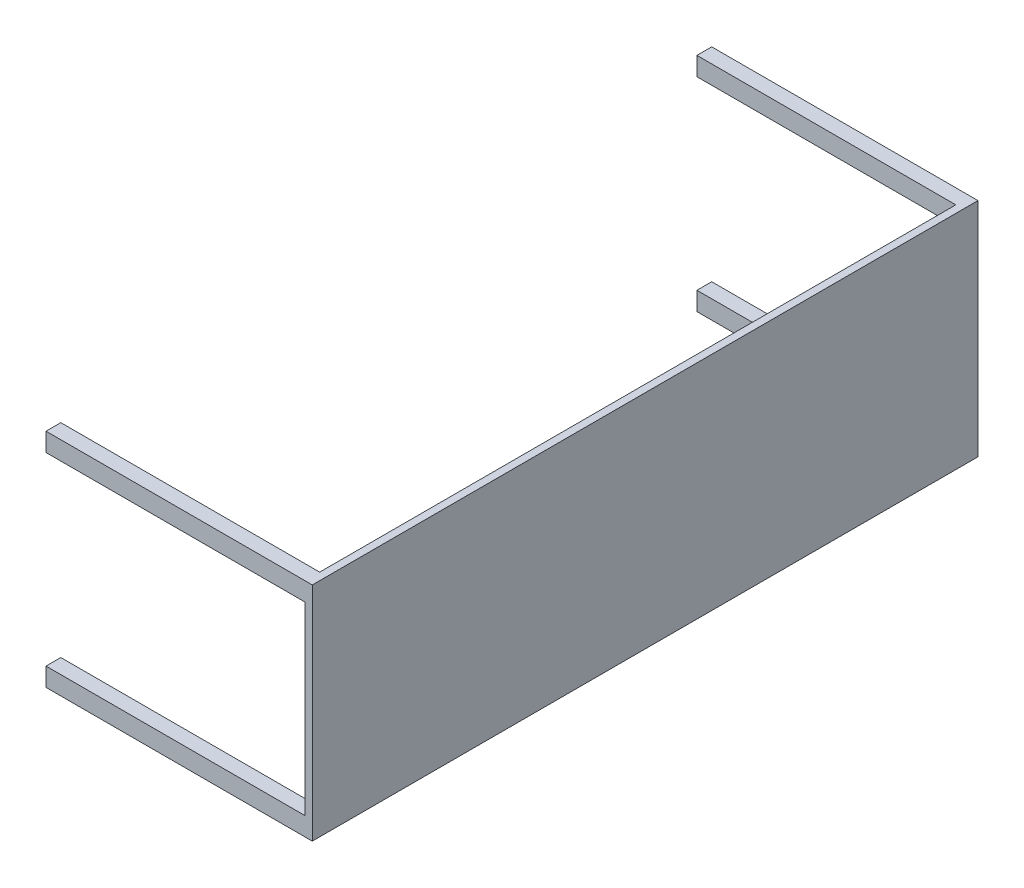
ISO-10303-21;
HEADER;
FILE_DESCRIPTION(('STEP AP214'),'2;1');
FILE_NAME('part.step','',(''),(''),'','','');
FILE_SCHEMA(('AUTOMOTIVE_DESIGN { 1 0 10303 214 1 1 1 1 }'));
ENDSEC;
DATA;
#1=APPLICATION_CONTEXT('core data for automotive mechanical design processes');
#2=APPLICATION_PROTOCOL_DEFINITION('international standard','automotive_design',2000,#1);
#3=PRODUCT_CONTEXT('',#1,'mechanical');
#4=PRODUCT('Part','Part','',(#3));
#5=PRODUCT_RELATED_PRODUCT_CATEGORY('part','',(#4));
#6=PRODUCT_DEFINITION_FORMATION('','',#4);
#7=PRODUCT_DEFINITION_CONTEXT('part definition',#1,'design');
#8=PRODUCT_DEFINITION('design','',#6,#7);
#9=PRODUCT_DEFINITION_SHAPE('','',#8);
#10=(LENGTH_UNIT() NAMED_UNIT(*) SI_UNIT(.MILLI.,.METRE.));
#11=(NAMED_UNIT(*) PLANE_ANGLE_UNIT() SI_UNIT($,.RADIAN.));
#12=(NAMED_UNIT(*) SI_UNIT($,.STERADIAN.) SOLID_ANGLE_UNIT());
#13=UNCERTAINTY_MEASURE_WITH_UNIT(LENGTH_MEASURE(1.E-05),#10,'distance_accuracy_value','');
#14=(GEOMETRIC_REPRESENTATION_CONTEXT(3) GLOBAL_UNCERTAINTY_ASSIGNED_CONTEXT((#13)) GLOBAL_UNIT_ASSIGNED_CONTEXT((#10,
#11,#12)) REPRESENTATION_CONTEXT('',''));
#15=CARTESIAN_POINT('',(0.,0.,0.));
#16=DIRECTION('',(0.,0.,1.));
#17=DIRECTION('',(1.,0.,0.));
#18=AXIS2_PLACEMENT_3D('',#15,#16,#17);
#19=CARTESIAN_POINT('',(0.,0.,0.));
#20=DIRECTION('',(1.,0.,0.));
#21=DIRECTION('',(0.,0.,-1.));
#22=AXIS2_PLACEMENT_3D('',#19,#20,#21);
#23=PLANE('',#22);
#24=DIRECTION('',(0.,1.,0.));
#25=VECTOR('',#24,1.);
#26=CARTESIAN_POINT('',(0.,410.745233968804,-1676.29116117851));
#27=LINE('',#26,#25);
#28=CARTESIAN_POINT('',(0.,360.745233968804,-1676.29116117851));
#29=VERTEX_POINT('',#28);
#30=CARTESIAN_POINT('',(0.,410.745233968804,-1676.29116117851));
#31=VERTEX_POINT('',#30);
#32=EDGE_CURVE('E214',#29,#31,#27,.T.);
#33=ORIENTED_EDGE('',*,*,#32,.F.);
#34=DIRECTION('',(0.,0.,1.));
#35=VECTOR('',#34,1.);
#36=CARTESIAN_POINT('',(0.,360.745233968804,-1676.29116117851));
#37=LINE('',#36,#35);
#38=CARTESIAN_POINT('',(0.,360.745233968804,-1716.29116117851));
#39=VERTEX_POINT('',#38);
#40=EDGE_CURVE('E68',#39,#29,#37,.T.);
#41=ORIENTED_EDGE('',*,*,#40,.F.);
#42=DIRECTION('',(0.,1.,0.));
#43=VECTOR('',#42,1.);
#44=CARTESIAN_POINT('',(0.,-189.254766031196,-1716.29116117851));
#45=LINE('',#44,#43);
#46=CARTESIAN_POINT('',(0.,-139.254766031196,-1716.29116117851));
#47=VERTEX_POINT('',#46);
#48=EDGE_CURVE('E159',#47,#39,#45,.T.);
#49=ORIENTED_EDGE('',*,*,#48,.F.);
#50=DIRECTION('',(0.,0.,-1.));
#51=VECTOR('',#50,1.);
#52=CARTESIAN_POINT('',(0.,-139.254766031196,-1676.29116117851));
#53=LINE('',#52,#51);
#54=CARTESIAN_POINT('',(0.,-139.254766031196,-1676.29116117851));
#55=VERTEX_POINT('',#54);
#56=EDGE_CURVE('E155',#55,#47,#53,.T.);
#57=ORIENTED_EDGE('',*,*,#56,.F.);
#58=DIRECTION('',(0.,1.,0.));
#59=VECTOR('',#58,1.);
#60=CARTESIAN_POINT('',(0.,-139.254766031196,-1676.29116117851));
#61=LINE('',#60,#59);
#62=CARTESIAN_POINT('',(0.,-189.254766031196,-1676.29116117851));
#63=VERTEX_POINT('',#62);
#64=EDGE_CURVE('E157',#63,#55,#61,.T.);
#65=ORIENTED_EDGE('',*,*,#64,.F.);
#66=DIRECTION('',(0.,0.,-1.));
#67=VECTOR('',#66,1.);
#68=CARTESIAN_POINT('',(0.,-189.254766031196,83.7088388214905));
#69=LINE('',#68,#67);
#70=CARTESIAN_POINT('',(0.,-189.254766031196,43.7088388214905));
#71=VERTEX_POINT('',#70);
#72=EDGE_CURVE('E295',#71,#63,#69,.T.);
#73=ORIENTED_EDGE('',*,*,#72,.F.);
#74=DIRECTION('',(0.,-1.,0.));
#75=VECTOR('',#74,1.);
#76=CARTESIAN_POINT('',(0.,-139.254766031196,43.7088388214905));
#77=LINE('',#76,#75);
#78=CARTESIAN_POINT('',(0.,-139.254766031196,43.7088388214905));
#79=VERTEX_POINT('',#78);
#80=EDGE_CURVE('E61',#79,#71,#77,.T.);
#81=ORIENTED_EDGE('',*,*,#80,.F.);
#82=DIRECTION('',(0.,0.,-1.));
#83=VECTOR('',#82,1.);
#84=CARTESIAN_POINT('',(0.,-139.254766031196,83.7088388214905));
#85=LINE('',#84,#83);
#86=CARTESIAN_POINT('',(0.,-139.254766031196,83.7088388214905));
#87=VERTEX_POINT('',#86);
#88=EDGE_CURVE('E205',#87,#79,#85,.T.);
#89=ORIENTED_EDGE('',*,*,#88,.F.);
#90=DIRECTION('',(0.,-1.,0.));
#91=VECTOR('',#90,1.);
#92=CARTESIAN_POINT('',(0.,-189.254766031196,83.7088388214905));
#93=LINE('',#92,#91);
#94=CARTESIAN_POINT('',(0.,360.745233968804,83.7088388214905));
#95=VERTEX_POINT('',#94);
#96=EDGE_CURVE('E301',#95,#87,#93,.T.);
#97=ORIENTED_EDGE('',*,*,#96,.F.);
#98=DIRECTION('',(0.,0.,1.));
#99=VECTOR('',#98,1.);
#100=CARTESIAN_POINT('',(0.,360.745233968804,83.7088388214905));
#101=LINE('',#100,#99);
#102=CARTESIAN_POINT('',(0.,360.745233968804,43.7088388214905));
#103=VERTEX_POINT('',#102);
#104=EDGE_CURVE('E267',#103,#95,#101,.T.);
#105=ORIENTED_EDGE('',*,*,#104,.F.);
#106=DIRECTION('',(0.,-1.,0.));
#107=VECTOR('',#106,1.);
#108=CARTESIAN_POINT('',(0.,410.745233968804,43.7088388214905));
#109=LINE('',#108,#107);
#110=CARTESIAN_POINT('',(0.,410.745233968804,43.7088388214905));
#111=VERTEX_POINT('',#110);
#112=EDGE_CURVE('E221',#111,#103,#109,.T.);
#113=ORIENTED_EDGE('',*,*,#112,.F.);
#114=DIRECTION('',(0.,0.,1.));
#115=VECTOR('',#114,1.);
#116=CARTESIAN_POINT('',(0.,410.745233968804,83.7088388214905));
#117=LINE('',#116,#115);
#118=EDGE_CURVE('E315',#31,#111,#117,.T.);
#119=ORIENTED_EDGE('',*,*,#118,.F.);
#120=EDGE_LOOP('',(#33,#41,#49,#57,#65,#73,#81,#89,#97,#105,#113,#119));
#121=FACE_BOUND('',#120,.T.);
#122=ADVANCED_FACE('F45',(#121),#23,.F.);
#123=CARTESIAN_POINT('',(20.,-189.254766031196,83.7088388214905));
#124=DIRECTION('',(0.,1.,0.));
#125=DIRECTION('',(0.,0.,1.));
#126=AXIS2_PLACEMENT_3D('',#123,#124,#125);
#127=PLANE('',#126);
#128=DIRECTION('',(-1.,0.,0.));
#129=VECTOR('',#128,1.);
#130=CARTESIAN_POINT('',(20.,-189.254766031196,83.7088388214905));
#131=LINE('',#130,#129);
#132=CARTESIAN_POINT('',(20.,-189.254766031196,83.7088388214905));
#133=VERTEX_POINT('',#132);
#134=CARTESIAN_POINT('',(-700.,-189.254766031196,83.7088388214905));
#135=VERTEX_POINT('',#134);
#136=EDGE_CURVE('E310',#133,#135,#131,.T.);
#137=ORIENTED_EDGE('',*,*,#136,.T.);
#138=DIRECTION('',(0.,0.,1.));
#139=VECTOR('',#138,1.);
#140=CARTESIAN_POINT('',(-700.,-189.254766031196,83.7088388214905));
#141=LINE('',#140,#139);
#142=CARTESIAN_POINT('',(-700.,-189.254766031196,43.7088388214905));
#143=VERTEX_POINT('',#142);
#144=EDGE_CURVE('E252',#143,#135,#141,.T.);
#145=ORIENTED_EDGE('',*,*,#144,.F.);
#146=DIRECTION('',(1.,0.,0.));
#147=VECTOR('',#146,1.);
#148=CARTESIAN_POINT('',(-700.,-189.254766031196,43.7088388214905));
#149=LINE('',#148,#147);
#150=EDGE_CURVE('E235',#143,#71,#149,.T.);
#151=ORIENTED_EDGE('',*,*,#150,.T.);
#152=ORIENTED_EDGE('',*,*,#72,.T.);
#153=DIRECTION('',(1.,0.,0.));
#154=VECTOR('',#153,1.);
#155=CARTESIAN_POINT('',(-700.,-189.254766031196,-1676.29116117851));
#156=LINE('',#155,#154);
#157=CARTESIAN_POINT('',(-700.,-189.254766031196,-1676.29116117851));
#158=VERTEX_POINT('',#157);
#159=EDGE_CURVE('E175',#158,#63,#156,.T.);
#160=ORIENTED_EDGE('',*,*,#159,.F.);
#161=DIRECTION('',(0.,0.,1.));
#162=VECTOR('',#161,1.);
#163=CARTESIAN_POINT('',(-700.,-189.254766031196,-1676.29116117851));
#164=LINE('',#163,#162);
#165=CARTESIAN_POINT('',(-700.,-189.254766031196,-1716.29116117851));
#166=VERTEX_POINT('',#165);
#167=EDGE_CURVE('E186',#166,#158,#164,.T.);
#168=ORIENTED_EDGE('',*,*,#167,.F.);
#169=DIRECTION('',(-1.,0.,0.));
#170=VECTOR('',#169,1.);
#171=CARTESIAN_POINT('',(20.,-189.254766031196,-1716.29116117851));
#172=LINE('',#171,#170);
#173=CARTESIAN_POINT('',(20.,-189.254766031196,-1716.29116117851));
#174=VERTEX_POINT('',#173);
#175=EDGE_CURVE('E11',#174,#166,#172,.T.);
#176=ORIENTED_EDGE('',*,*,#175,.F.);
#177=DIRECTION('',(0.,0.,-1.));
#178=VECTOR('',#177,1.);
#179=CARTESIAN_POINT('',(20.,-189.254766031196,83.7088388214905));
#180=LINE('',#179,#178);
#181=EDGE_CURVE('E296',#133,#174,#180,.T.);
#182=ORIENTED_EDGE('',*,*,#181,.F.);
#183=EDGE_LOOP('',(#137,#145,#151,#152,#160,#168,#176,#182));
#184=FACE_BOUND('',#183,.T.);
#185=ADVANCED_FACE('F47',(#184),#127,.F.);
#186=CARTESIAN_POINT('',(20.,-189.254766031196,-1716.29116117851));
#187=DIRECTION('',(0.,0.,1.));
#188=DIRECTION('',(1.,0.,0.));
#189=AXIS2_PLACEMENT_3D('',#186,#187,#188);
#190=PLANE('',#189);
#191=ORIENTED_EDGE('',*,*,#175,.T.);
#192=DIRECTION('',(0.,-1.,0.));
#193=VECTOR('',#192,1.);
#194=CARTESIAN_POINT('',(-700.,-139.254766031196,-1716.29116117851));
#195=LINE('',#194,#193);
#196=CARTESIAN_POINT('',(-700.,-139.254766031196,-1716.29116117851));
#197=VERTEX_POINT('',#196);
#198=EDGE_CURVE('E194',#197,#166,#195,.T.);
#199=ORIENTED_EDGE('',*,*,#198,.F.);
#200=DIRECTION('',(1.,0.,0.));
#201=VECTOR('',#200,1.);
#202=CARTESIAN_POINT('',(-700.,-139.254766031196,-1716.29116117851));
#203=LINE('',#202,#201);
#204=EDGE_CURVE('E188',#197,#47,#203,.T.);
#205=ORIENTED_EDGE('',*,*,#204,.T.);
#206=ORIENTED_EDGE('',*,*,#48,.T.);
#207=DIRECTION('',(1.,0.,0.));
#208=VECTOR('',#207,1.);
#209=CARTESIAN_POINT('',(-700.,360.745233968804,-1716.29116117851));
#210=LINE('',#209,#208);
#211=CARTESIAN_POINT('',(-700.,360.745233968804,-1716.29116117851));
#212=VERTEX_POINT('',#211);
#213=EDGE_CURVE('E200',#212,#39,#210,.T.);
#214=ORIENTED_EDGE('',*,*,#213,.F.);
#215=DIRECTION('',(0.,-1.,0.));
#216=VECTOR('',#215,1.);
#217=CARTESIAN_POINT('',(-700.,410.745233968804,-1716.29116117851));
#218=LINE('',#217,#216);
#219=CARTESIAN_POINT('',(-700.,410.745233968804,-1716.29116117851));
#220=VERTEX_POINT('',#219);
#221=EDGE_CURVE('E227',#220,#212,#218,.T.);
#222=ORIENTED_EDGE('',*,*,#221,.F.);
#223=DIRECTION('',(-1.,0.,0.));
#224=VECTOR('',#223,1.);
#225=CARTESIAN_POINT('',(20.,410.745233968804,-1716.29116117851));
#226=LINE('',#225,#224);
#227=CARTESIAN_POINT('',(20.,410.745233968804,-1716.29116117851));
#228=VERTEX_POINT('',#227);
#229=EDGE_CURVE('E54',#228,#220,#226,.T.);
#230=ORIENTED_EDGE('',*,*,#229,.F.);
#231=DIRECTION('',(0.,1.,0.));
#232=VECTOR('',#231,1.);
#233=CARTESIAN_POINT('',(20.,-189.254766031196,-1716.29116117851));
#234=LINE('',#233,#232);
#235=EDGE_CURVE('E300',#174,#228,#234,.T.);
#236=ORIENTED_EDGE('',*,*,#235,.F.);
#237=EDGE_LOOP('',(#191,#199,#205,#206,#214,#222,#230,#236));
#238=FACE_BOUND('',#237,.T.);
#239=ADVANCED_FACE('F336',(#238),#190,.F.);
#240=CARTESIAN_POINT('',(20.,410.745233968804,83.7088388214905));
#241=DIRECTION('',(0.,-1.,0.));
#242=DIRECTION('',(0.,0.,-1.));
#243=AXIS2_PLACEMENT_3D('',#240,#241,#242);
#244=PLANE('',#243);
#245=ORIENTED_EDGE('',*,*,#229,.T.);
#246=DIRECTION('',(0.,0.,-1.));
#247=VECTOR('',#246,1.);
#248=CARTESIAN_POINT('',(-700.,410.745233968804,-1676.29116117851));
#249=LINE('',#248,#247);
#250=CARTESIAN_POINT('',(-700.,410.745233968804,-1676.29116117851));
#251=VERTEX_POINT('',#250);
#252=EDGE_CURVE('E218',#251,#220,#249,.T.);
#253=ORIENTED_EDGE('',*,*,#252,.F.);
#254=DIRECTION('',(1.,0.,0.));
#255=VECTOR('',#254,1.);
#256=CARTESIAN_POINT('',(-700.,410.745233968804,-1676.29116117851));
#257=LINE('',#256,#255);
#258=EDGE_CURVE('E209',#251,#31,#257,.T.);
#259=ORIENTED_EDGE('',*,*,#258,.T.);
#260=ORIENTED_EDGE('',*,*,#118,.T.);
#261=DIRECTION('',(1.,0.,0.));
#262=VECTOR('',#261,1.);
#263=CARTESIAN_POINT('',(-700.,410.745233968804,43.7088388214905));
#264=LINE('',#263,#262);
#265=CARTESIAN_POINT('',(-700.,410.745233968804,43.7088388214905));
#266=VERTEX_POINT('',#265);
#267=EDGE_CURVE('E291',#266,#111,#264,.T.);
#268=ORIENTED_EDGE('',*,*,#267,.F.);
#269=DIRECTION('',(0.,0.,-1.));
#270=VECTOR('',#269,1.);
#271=CARTESIAN_POINT('',(-700.,410.745233968804,83.7088388214905));
#272=LINE('',#271,#270);
#273=CARTESIAN_POINT('',(-700.,410.745233968804,83.7088388214905));
#274=VERTEX_POINT('',#273);
#275=EDGE_CURVE('E262',#274,#266,#272,.T.);
#276=ORIENTED_EDGE('',*,*,#275,.F.);
#277=DIRECTION('',(-1.,0.,0.));
#278=VECTOR('',#277,1.);
#279=CARTESIAN_POINT('',(20.,410.745233968804,83.7088388214905));
#280=LINE('',#279,#278);
#281=CARTESIAN_POINT('',(20.,410.745233968804,83.7088388214905));
#282=VERTEX_POINT('',#281);
#283=EDGE_CURVE('E324',#282,#274,#280,.T.);
#284=ORIENTED_EDGE('',*,*,#283,.F.);
#285=DIRECTION('',(0.,0.,1.));
#286=VECTOR('',#285,1.);
#287=CARTESIAN_POINT('',(20.,410.745233968804,83.7088388214905));
#288=LINE('',#287,#286);
#289=EDGE_CURVE('E304',#228,#282,#288,.T.);
#290=ORIENTED_EDGE('',*,*,#289,.F.);
#291=EDGE_LOOP('',(#245,#253,#259,#260,#268,#276,#284,#290));
#292=FACE_BOUND('',#291,.T.);
#293=ADVANCED_FACE('F332',(#292),#244,.F.);
#294=CARTESIAN_POINT('',(20.,-189.254766031196,83.7088388214905));
#295=DIRECTION('',(0.,0.,-1.));
#296=DIRECTION('',(-1.,0.,0.));
#297=AXIS2_PLACEMENT_3D('',#294,#295,#296);
#298=PLANE('',#297);
#299=ORIENTED_EDGE('',*,*,#283,.T.);
#300=DIRECTION('',(0.,1.,0.));
#301=VECTOR('',#300,1.);
#302=CARTESIAN_POINT('',(-700.,410.745233968804,83.7088388214905));
#303=LINE('',#302,#301);
#304=CARTESIAN_POINT('',(-700.,360.745233968804,83.7088388214905));
#305=VERTEX_POINT('',#304);
#306=EDGE_CURVE('E273',#305,#274,#303,.T.);
#307=ORIENTED_EDGE('',*,*,#306,.F.);
#308=DIRECTION('',(1.,0.,0.));
#309=VECTOR('',#308,1.);
#310=CARTESIAN_POINT('',(-700.,360.745233968804,83.7088388214905));
#311=LINE('',#310,#309);
#312=EDGE_CURVE('E277',#305,#95,#311,.T.);
#313=ORIENTED_EDGE('',*,*,#312,.T.);
#314=ORIENTED_EDGE('',*,*,#96,.T.);
#315=DIRECTION('',(1.,0.,0.));
#316=VECTOR('',#315,1.);
#317=CARTESIAN_POINT('',(-700.,-139.254766031196,83.7088388214905));
#318=LINE('',#317,#316);
#319=CARTESIAN_POINT('',(-700.,-139.254766031196,83.7088388214905));
#320=VERTEX_POINT('',#319);
#321=EDGE_CURVE('E239',#320,#87,#318,.T.);
#322=ORIENTED_EDGE('',*,*,#321,.F.);
#323=DIRECTION('',(0.,1.,0.));
#324=VECTOR('',#323,1.);
#325=CARTESIAN_POINT('',(-700.,-139.254766031196,83.7088388214905));
#326=LINE('',#325,#324);
#327=EDGE_CURVE('E243',#135,#320,#326,.T.);
#328=ORIENTED_EDGE('',*,*,#327,.F.);
#329=ORIENTED_EDGE('',*,*,#136,.F.);
#330=DIRECTION('',(0.,-1.,0.));
#331=VECTOR('',#330,1.);
#332=CARTESIAN_POINT('',(20.,-189.254766031196,83.7088388214905));
#333=LINE('',#332,#331);
#334=EDGE_CURVE('E307',#282,#133,#333,.T.);
#335=ORIENTED_EDGE('',*,*,#334,.F.);
#336=EDGE_LOOP('',(#299,#307,#313,#314,#322,#328,#329,#335));
#337=FACE_BOUND('',#336,.T.);
#338=ADVANCED_FACE('F357',(#337),#298,.F.);
#339=CARTESIAN_POINT('',(20.,0.,0.));
#340=DIRECTION('',(1.,0.,0.));
#341=DIRECTION('',(0.,0.,-1.));
#342=AXIS2_PLACEMENT_3D('',#339,#340,#341);
#343=PLANE('',#342);
#344=ORIENTED_EDGE('',*,*,#181,.T.);
#345=ORIENTED_EDGE('',*,*,#235,.T.);
#346=ORIENTED_EDGE('',*,*,#289,.T.);
#347=ORIENTED_EDGE('',*,*,#334,.T.);
#348=EDGE_LOOP('',(#344,#345,#346,#347));
#349=FACE_BOUND('',#348,.T.);
#350=ADVANCED_FACE('F361',(#349),#343,.T.);
#351=CARTESIAN_POINT('',(-700.,410.745233968804,43.7088388214905));
#352=DIRECTION('',(0.,0.,1.));
#353=DIRECTION('',(1.,0.,0.));
#354=AXIS2_PLACEMENT_3D('',#351,#352,#353);
#355=PLANE('',#354);
#356=ORIENTED_EDGE('',*,*,#112,.T.);
#357=DIRECTION('',(1.,0.,0.));
#358=VECTOR('',#357,1.);
#359=CARTESIAN_POINT('',(-700.,360.745233968804,43.7088388214905));
#360=LINE('',#359,#358);
#361=CARTESIAN_POINT('',(-700.,360.745233968804,43.7088388214905));
#362=VERTEX_POINT('',#361);
#363=EDGE_CURVE('E287',#362,#103,#360,.T.);
#364=ORIENTED_EDGE('',*,*,#363,.F.);
#365=DIRECTION('',(0.,-1.,0.));
#366=VECTOR('',#365,1.);
#367=CARTESIAN_POINT('',(-700.,410.745233968804,43.7088388214905));
#368=LINE('',#367,#366);
#369=EDGE_CURVE('E266',#266,#362,#368,.T.);
#370=ORIENTED_EDGE('',*,*,#369,.F.);
#371=ORIENTED_EDGE('',*,*,#267,.T.);
#372=EDGE_LOOP('',(#356,#364,#370,#371));
#373=FACE_BOUND('',#372,.T.);
#374=ADVANCED_FACE('F348',(#373),#355,.F.);
#375=CARTESIAN_POINT('',(-700.,360.745233968804,83.7088388214905));
#376=DIRECTION('',(0.,1.,0.));
#377=DIRECTION('',(0.,0.,1.));
#378=AXIS2_PLACEMENT_3D('',#375,#376,#377);
#379=PLANE('',#378);
#380=ORIENTED_EDGE('',*,*,#104,.T.);
#381=ORIENTED_EDGE('',*,*,#312,.F.);
#382=DIRECTION('',(0.,0.,1.));
#383=VECTOR('',#382,1.);
#384=CARTESIAN_POINT('',(-700.,360.745233968804,83.7088388214905));
#385=LINE('',#384,#383);
#386=EDGE_CURVE('E270',#362,#305,#385,.T.);
#387=ORIENTED_EDGE('',*,*,#386,.F.);
#388=ORIENTED_EDGE('',*,*,#363,.T.);
#389=EDGE_LOOP('',(#380,#381,#387,#388));
#390=FACE_BOUND('',#389,.T.);
#391=ADVANCED_FACE('F378',(#390),#379,.F.);
#392=CARTESIAN_POINT('',(-700.,0.,0.));
#393=DIRECTION('',(-1.,0.,0.));
#394=DIRECTION('',(0.,0.,1.));
#395=AXIS2_PLACEMENT_3D('',#392,#393,#394);
#396=PLANE('',#395);
#397=ORIENTED_EDGE('',*,*,#275,.T.);
#398=ORIENTED_EDGE('',*,*,#369,.T.);
#399=ORIENTED_EDGE('',*,*,#386,.T.);
#400=ORIENTED_EDGE('',*,*,#306,.T.);
#401=EDGE_LOOP('',(#397,#398,#399,#400));
#402=FACE_BOUND('',#401,.T.);
#403=ADVANCED_FACE('F352',(#402),#396,.T.);
#404=CARTESIAN_POINT('',(-700.,-139.254766031196,-1676.29116117851));
#405=DIRECTION('',(0.,-1.,0.));
#406=DIRECTION('',(0.,0.,-1.));
#407=AXIS2_PLACEMENT_3D('',#404,#405,#406);
#408=PLANE('',#407);
#409=ORIENTED_EDGE('',*,*,#56,.T.);
#410=ORIENTED_EDGE('',*,*,#204,.F.);
#411=DIRECTION('',(0.,0.,-1.));
#412=VECTOR('',#411,1.);
#413=CARTESIAN_POINT('',(-700.,-139.254766031196,-1676.29116117851));
#414=LINE('',#413,#412);
#415=CARTESIAN_POINT('',(-700.,-139.254766031196,-1676.29116117851));
#416=VERTEX_POINT('',#415);
#417=EDGE_CURVE('E177',#416,#197,#414,.T.);
#418=ORIENTED_EDGE('',*,*,#417,.F.);
#419=DIRECTION('',(1.,0.,0.));
#420=VECTOR('',#419,1.);
#421=CARTESIAN_POINT('',(-700.,-139.254766031196,-1676.29116117851));
#422=LINE('',#421,#420);
#423=EDGE_CURVE('E172',#416,#55,#422,.T.);
#424=ORIENTED_EDGE('',*,*,#423,.T.);
#425=EDGE_LOOP('',(#409,#410,#418,#424));
#426=FACE_BOUND('',#425,.T.);
#427=ADVANCED_FACE('F179',(#426),#408,.F.);
#428=CARTESIAN_POINT('',(-700.,-139.254766031196,-1676.29116117851));
#429=DIRECTION('',(0.,0.,-1.));
#430=DIRECTION('',(-1.,0.,0.));
#431=AXIS2_PLACEMENT_3D('',#428,#429,#430);
#432=PLANE('',#431);
#433=ORIENTED_EDGE('',*,*,#64,.T.);
#434=ORIENTED_EDGE('',*,*,#423,.F.);
#435=DIRECTION('',(0.,1.,0.));
#436=VECTOR('',#435,1.);
#437=CARTESIAN_POINT('',(-700.,-139.254766031196,-1676.29116117851));
#438=LINE('',#437,#436);
#439=EDGE_CURVE('E182',#158,#416,#438,.T.);
#440=ORIENTED_EDGE('',*,*,#439,.F.);
#441=ORIENTED_EDGE('',*,*,#159,.T.);
#442=EDGE_LOOP('',(#433,#434,#440,#441));
#443=FACE_BOUND('',#442,.T.);
#444=ADVANCED_FACE('F170',(#443),#432,.F.);
#445=CARTESIAN_POINT('',(-700.,0.,0.));
#446=DIRECTION('',(-1.,0.,0.));
#447=DIRECTION('',(0.,0.,1.));
#448=AXIS2_PLACEMENT_3D('',#445,#446,#447);
#449=PLANE('',#448);
#450=ORIENTED_EDGE('',*,*,#417,.T.);
#451=ORIENTED_EDGE('',*,*,#198,.T.);
#452=ORIENTED_EDGE('',*,*,#167,.T.);
#453=ORIENTED_EDGE('',*,*,#439,.T.);
#454=EDGE_LOOP('',(#450,#451,#452,#453));
#455=FACE_BOUND('',#454,.T.);
#456=ADVANCED_FACE('F366',(#455),#449,.T.);
#457=CARTESIAN_POINT('',(-700.,-139.254766031196,83.7088388214905));
#458=DIRECTION('',(0.,-1.,0.));
#459=DIRECTION('',(0.,0.,-1.));
#460=AXIS2_PLACEMENT_3D('',#457,#458,#459);
#461=PLANE('',#460);
#462=ORIENTED_EDGE('',*,*,#88,.T.);
#463=DIRECTION('',(1.,0.,0.));
#464=VECTOR('',#463,1.);
#465=CARTESIAN_POINT('',(-700.,-139.254766031196,43.7088388214905));
#466=LINE('',#465,#464);
#467=CARTESIAN_POINT('',(-700.,-139.254766031196,43.7088388214905));
#468=VERTEX_POINT('',#467);
#469=EDGE_CURVE('E165',#468,#79,#466,.T.);
#470=ORIENTED_EDGE('',*,*,#469,.F.);
#471=DIRECTION('',(0.,0.,-1.));
#472=VECTOR('',#471,1.);
#473=CARTESIAN_POINT('',(-700.,-139.254766031196,83.7088388214905));
#474=LINE('',#473,#472);
#475=EDGE_CURVE('E246',#320,#468,#474,.T.);
#476=ORIENTED_EDGE('',*,*,#475,.F.);
#477=ORIENTED_EDGE('',*,*,#321,.T.);
#478=EDGE_LOOP('',(#462,#470,#476,#477));
#479=FACE_BOUND('',#478,.T.);
#480=ADVANCED_FACE('F374',(#479),#461,.F.);
#481=CARTESIAN_POINT('',(-700.,-139.254766031196,43.7088388214905));
#482=DIRECTION('',(0.,0.,1.));
#483=DIRECTION('',(0.,-1.,0.));
#484=AXIS2_PLACEMENT_3D('',#481,#482,#483);
#485=PLANE('',#484);
#486=ORIENTED_EDGE('',*,*,#80,.T.);
#487=ORIENTED_EDGE('',*,*,#150,.F.);
#488=DIRECTION('',(0.,-1.,0.));
#489=VECTOR('',#488,1.);
#490=CARTESIAN_POINT('',(-700.,-139.254766031196,43.7088388214905));
#491=LINE('',#490,#489);
#492=EDGE_CURVE('E256',#468,#143,#491,.T.);
#493=ORIENTED_EDGE('',*,*,#492,.F.);
#494=ORIENTED_EDGE('',*,*,#469,.T.);
#495=EDGE_LOOP('',(#486,#487,#493,#494));
#496=FACE_BOUND('',#495,.T.);
#497=ADVANCED_FACE('F370',(#496),#485,.F.);
#498=CARTESIAN_POINT('',(-700.,0.,0.));
#499=DIRECTION('',(-1.,0.,0.));
#500=DIRECTION('',(0.,0.,1.));
#501=AXIS2_PLACEMENT_3D('',#498,#499,#500);
#502=PLANE('',#501);
#503=ORIENTED_EDGE('',*,*,#475,.T.);
#504=ORIENTED_EDGE('',*,*,#492,.T.);
#505=ORIENTED_EDGE('',*,*,#144,.T.);
#506=ORIENTED_EDGE('',*,*,#327,.T.);
#507=EDGE_LOOP('',(#503,#504,#505,#506));
#508=FACE_BOUND('',#507,.T.);
#509=ADVANCED_FACE('F471',(#508),#502,.T.);
#510=CARTESIAN_POINT('',(-700.,360.745233968804,-1676.29116117851));
#511=DIRECTION('',(0.,1.,0.));
#512=DIRECTION('',(0.,0.,1.));
#513=AXIS2_PLACEMENT_3D('',#510,#511,#512);
#514=PLANE('',#513);
#515=ORIENTED_EDGE('',*,*,#40,.T.);
#516=DIRECTION('',(1.,0.,0.));
#517=VECTOR('',#516,1.);
#518=CARTESIAN_POINT('',(-700.,360.745233968804,-1676.29116117851));
#519=LINE('',#518,#517);
#520=CARTESIAN_POINT('',(-700.,360.745233968804,-1676.29116117851));
#521=VERTEX_POINT('',#520);
#522=EDGE_CURVE('E204',#521,#29,#519,.T.);
#523=ORIENTED_EDGE('',*,*,#522,.F.);
#524=DIRECTION('',(0.,0.,1.));
#525=VECTOR('',#524,1.);
#526=CARTESIAN_POINT('',(-700.,360.745233968804,-1676.29116117851));
#527=LINE('',#526,#525);
#528=EDGE_CURVE('E224',#212,#521,#527,.T.);
#529=ORIENTED_EDGE('',*,*,#528,.F.);
#530=ORIENTED_EDGE('',*,*,#213,.T.);
#531=EDGE_LOOP('',(#515,#523,#529,#530));
#532=FACE_BOUND('',#531,.T.);
#533=ADVANCED_FACE('F480',(#532),#514,.F.);
#534=CARTESIAN_POINT('',(-700.,410.745233968804,-1676.29116117851));
#535=DIRECTION('',(0.,0.,-1.));
#536=DIRECTION('',(-1.,0.,0.));
#537=AXIS2_PLACEMENT_3D('',#534,#535,#536);
#538=PLANE('',#537);
#539=ORIENTED_EDGE('',*,*,#32,.T.);
#540=ORIENTED_EDGE('',*,*,#258,.F.);
#541=DIRECTION('',(0.,1.,0.));
#542=VECTOR('',#541,1.);
#543=CARTESIAN_POINT('',(-700.,410.745233968804,-1676.29116117851));
#544=LINE('',#543,#542);
#545=EDGE_CURVE('E213',#521,#251,#544,.T.);
#546=ORIENTED_EDGE('',*,*,#545,.F.);
#547=ORIENTED_EDGE('',*,*,#522,.T.);
#548=EDGE_LOOP('',(#539,#540,#546,#547));
#549=FACE_BOUND('',#548,.T.);
#550=ADVANCED_FACE('F344',(#549),#538,.F.);
#551=CARTESIAN_POINT('',(-700.,0.,0.));
#552=DIRECTION('',(-1.,0.,0.));
#553=DIRECTION('',(0.,0.,1.));
#554=AXIS2_PLACEMENT_3D('',#551,#552,#553);
#555=PLANE('',#554);
#556=ORIENTED_EDGE('',*,*,#252,.T.);
#557=ORIENTED_EDGE('',*,*,#221,.T.);
#558=ORIENTED_EDGE('',*,*,#528,.T.);
#559=ORIENTED_EDGE('',*,*,#545,.T.);
#560=EDGE_LOOP('',(#556,#557,#558,#559));
#561=FACE_BOUND('',#560,.T.);
#562=ADVANCED_FACE('F339',(#561),#555,.T.);
#563=CLOSED_SHELL('',(#122,#185,#239,#293,#338,#350,#374,#391,#403,#427,#444,#456,#480,#497,
#509,#533,#550,#562));
#564=MANIFOLD_SOLID_BREP('B2',#563);
#565=ADVANCED_BREP_SHAPE_REPRESENTATION('',(#18,#564),#14);
#566=SHAPE_DEFINITION_REPRESENTATION(#9,#565);
ENDSEC;
END-ISO-10303-21;
